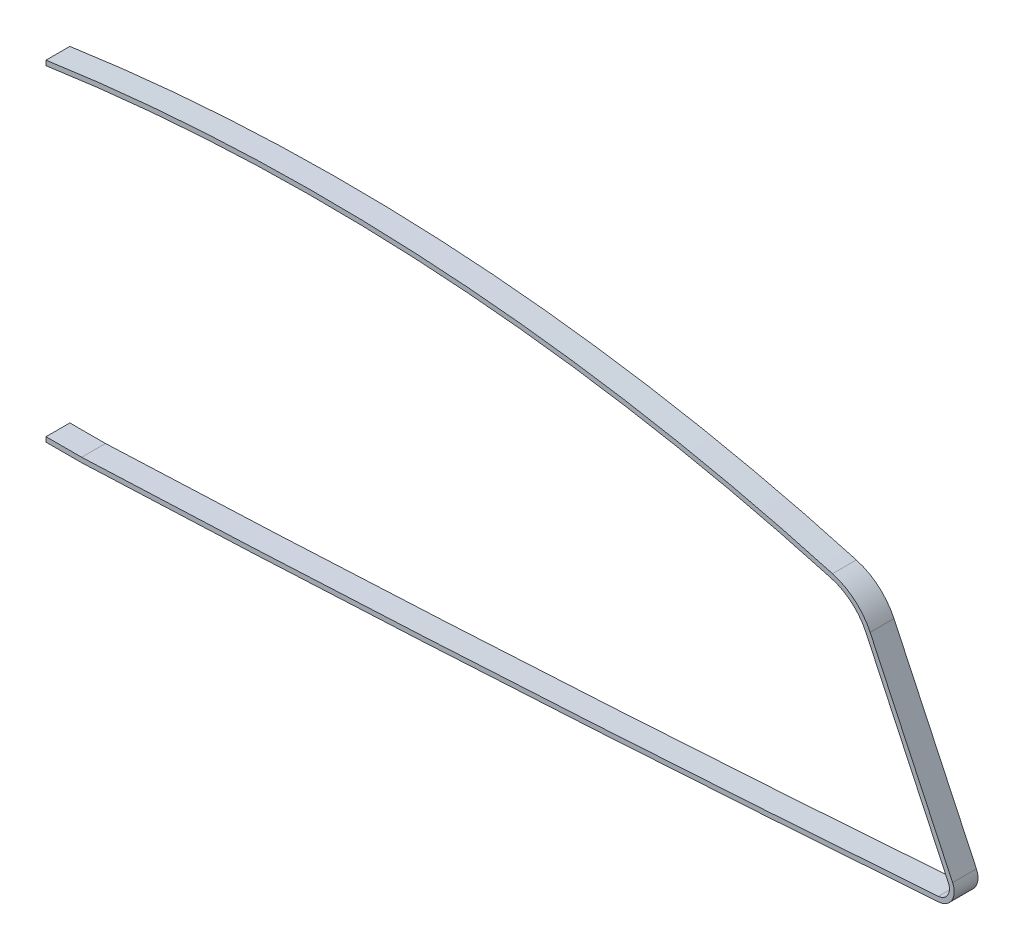
ISO-10303-21;
HEADER;
FILE_DESCRIPTION(('STEP AP214'),'2;1');
FILE_NAME('part.step','',(''),(''),'','','');
FILE_SCHEMA(('AUTOMOTIVE_DESIGN { 1 0 10303 214 1 1 1 1 }'));
ENDSEC;
DATA;
#1=APPLICATION_CONTEXT('core data for automotive mechanical design processes');
#2=APPLICATION_PROTOCOL_DEFINITION('international standard','automotive_design',2000,#1);
#3=PRODUCT_CONTEXT('',#1,'mechanical');
#4=PRODUCT('Part','Part','',(#3));
#5=PRODUCT_RELATED_PRODUCT_CATEGORY('part','',(#4));
#6=PRODUCT_DEFINITION_FORMATION('','',#4);
#7=PRODUCT_DEFINITION_CONTEXT('part definition',#1,'design');
#8=PRODUCT_DEFINITION('design','',#6,#7);
#9=PRODUCT_DEFINITION_SHAPE('','',#8);
#10=(LENGTH_UNIT() NAMED_UNIT(*) SI_UNIT(.MILLI.,.METRE.));
#11=(NAMED_UNIT(*) PLANE_ANGLE_UNIT() SI_UNIT($,.RADIAN.));
#12=(NAMED_UNIT(*) SI_UNIT($,.STERADIAN.) SOLID_ANGLE_UNIT());
#13=UNCERTAINTY_MEASURE_WITH_UNIT(LENGTH_MEASURE(1.E-05),#10,'distance_accuracy_value','');
#14=(GEOMETRIC_REPRESENTATION_CONTEXT(3) GLOBAL_UNCERTAINTY_ASSIGNED_CONTEXT((#13)) GLOBAL_UNIT_ASSIGNED_CONTEXT((#10,
#11,#12)) REPRESENTATION_CONTEXT('',''));
#15=CARTESIAN_POINT('',(0.,0.,0.));
#16=DIRECTION('',(0.,0.,1.));
#17=DIRECTION('',(1.,0.,0.));
#18=AXIS2_PLACEMENT_3D('',#15,#16,#17);
#19=CARTESIAN_POINT('',(-300.,67.7500000000004,6.));
#20=DIRECTION('',(0.,0.,1.));
#21=DIRECTION('',(1.,0.,0.));
#22=AXIS2_PLACEMENT_3D('',#19,#20,#21);
#23=PLANE('',#22);
#24=DIRECTION('',(0.,1.,0.));
#25=VECTOR('',#24,1.);
#26=CARTESIAN_POINT('',(20.,67.7500000000004,6.));
#27=LINE('',#26,#25);
#28=CARTESIAN_POINT('',(20.,-117.000000000003,6.));
#29=VERTEX_POINT('',#28);
#30=CARTESIAN_POINT('',(20.,-115.000000000003,6.));
#31=VERTEX_POINT('',#30);
#32=EDGE_CURVE('E54',#29,#31,#27,.T.);
#33=ORIENTED_EDGE('',*,*,#32,.F.);
#34=DIRECTION('',(1.,0.,0.));
#35=VECTOR('',#34,1.);
#36=CARTESIAN_POINT('',(-293.242078622232,-117.,6.));
#37=LINE('',#36,#35);
#38=CARTESIAN_POINT('',(34.999999999999,-117.000000000003,6.));
#39=VERTEX_POINT('',#38);
#40=EDGE_CURVE('E206',#29,#39,#37,.T.);
#41=ORIENTED_EDGE('',*,*,#40,.T.);
#42=CARTESIAN_POINT('',(-390.042918454936,10661.669527897,6.));
#43=DIRECTION('',(0.,0.,1.));
#44=DIRECTION('',(1.,0.,0.));
#45=AXIS2_PLACEMENT_3D('',#42,#43,#44);
#46=CIRCLE('',#45,10787.046781865);
#47=CARTESIAN_POINT('',(394.557793346134,-96.8052709388142,6.));
#48=VERTEX_POINT('',#47);
#49=EDGE_CURVE('E209',#39,#48,#46,.T.);
#50=ORIENTED_EDGE('',*,*,#49,.T.);
#51=CARTESIAN_POINT('',(394.048645189676,-89.8238120543996,6.));
#52=DIRECTION('',(0.,0.,1.));
#53=DIRECTION('',(1.,0.,0.));
#54=AXIS2_PLACEMENT_3D('',#51,#52,#53);
#55=CIRCLE('',#54,6.99999999999983);
#56=CARTESIAN_POINT('',(400.38450740077,-86.847766012747,6.));
#57=VERTEX_POINT('',#56);
#58=EDGE_CURVE('E213',#48,#57,#55,.T.);
#59=ORIENTED_EDGE('',*,*,#58,.T.);
#60=DIRECTION('',(-0.425149434520998,0.905123173013748,0.));
#61=VECTOR('',#60,1.);
#62=CARTESIAN_POINT('',(400.38450740077,-86.847766012747,6.));
#63=LINE('',#62,#61);
#64=CARTESIAN_POINT('',(365.795573070506,-13.2095497760361,6.));
#65=VERTEX_POINT('',#64);
#66=EDGE_CURVE('E216',#57,#65,#63,.T.);
#67=ORIENTED_EDGE('',*,*,#66,.T.);
#68=CARTESIAN_POINT('',(343.167493745163,-23.8382856390613,6.));
#69=DIRECTION('',(0.,0.,1.));
#70=DIRECTION('',(1.,0.,0.));
#71=AXIS2_PLACEMENT_3D('',#68,#69,#70);
#72=CIRCLE('',#71,24.9999999999999);
#73=CARTESIAN_POINT('',(349.996014283607,0.211065854399894,6.));
#74=VERTEX_POINT('',#73);
#75=EDGE_CURVE('E219',#65,#74,#72,.T.);
#76=ORIENTED_EDGE('',*,*,#75,.T.);
#77=CARTESIAN_POINT('',(134.630812730757,-758.283164695986,6.));
#78=DIRECTION('',(0.,0.,1.));
#79=DIRECTION('',(1.,0.,0.));
#80=AXIS2_PLACEMENT_3D('',#77,#78,#79);
#81=CIRCLE('',#80,788.476802333538);
#82=CARTESIAN_POINT('',(20.,21.8164729086009,6.));
#83=VERTEX_POINT('',#82);
#84=EDGE_CURVE('E150',#74,#83,#81,.T.);
#85=ORIENTED_EDGE('',*,*,#84,.T.);
#86=CARTESIAN_POINT('',(20.,19.7949402404488,6.));
#87=VERTEX_POINT('',#86);
#88=EDGE_CURVE('E138',#87,#83,#27,.T.);
#89=ORIENTED_EDGE('',*,*,#88,.F.);
#90=CARTESIAN_POINT('',(134.630812730757,-758.283164695986,6.));
#91=DIRECTION('',(0.,0.,1.));
#92=DIRECTION('',(1.,0.,0.));
#93=AXIS2_PLACEMENT_3D('',#90,#91,#92);
#94=CIRCLE('',#93,786.476802333538);
#95=CARTESIAN_POINT('',(349.449732640531,-1.71288226507704,6.));
#96=VERTEX_POINT('',#95);
#97=EDGE_CURVE('E148',#96,#87,#94,.T.);
#98=ORIENTED_EDGE('',*,*,#97,.F.);
#99=CARTESIAN_POINT('',(343.167493745163,-23.8382856390613,6.));
#100=DIRECTION('',(0.,0.,1.));
#101=DIRECTION('',(1.,0.,0.));
#102=AXIS2_PLACEMENT_3D('',#99,#100,#101);
#103=CIRCLE('',#102,22.9999999999998);
#104=CARTESIAN_POINT('',(363.985326724479,-14.0598486450781,6.));
#105=VERTEX_POINT('',#104);
#106=EDGE_CURVE('E158',#105,#96,#103,.T.);
#107=ORIENTED_EDGE('',*,*,#106,.F.);
#108=DIRECTION('',(-0.425149434521011,0.905123173013742,0.));
#109=VECTOR('',#108,1.);
#110=CARTESIAN_POINT('',(398.574261054744,-87.6980648817886,6.));
#111=LINE('',#110,#109);
#112=CARTESIAN_POINT('',(398.574261054744,-87.6980648817886,6.));
#113=VERTEX_POINT('',#112);
#114=EDGE_CURVE('E164',#113,#105,#111,.T.);
#115=ORIENTED_EDGE('',*,*,#114,.F.);
#116=CARTESIAN_POINT('',(394.048645189676,-89.8238120543996,6.));
#117=DIRECTION('',(0.,0.,1.));
#118=DIRECTION('',(1.,0.,0.));
#119=AXIS2_PLACEMENT_3D('',#116,#117,#118);
#120=CIRCLE('',#119,5.00000000000083);
#121=CARTESIAN_POINT('',(394.412322444288,-94.810568400411,6.));
#122=VERTEX_POINT('',#121);
#123=EDGE_CURVE('E298',#122,#113,#120,.T.);
#124=ORIENTED_EDGE('',*,*,#123,.F.);
#125=CARTESIAN_POINT('',(-390.042918454936,10661.669527897,6.));
#126=DIRECTION('',(0.,0.,1.));
#127=DIRECTION('',(1.,0.,0.));
#128=AXIS2_PLACEMENT_3D('',#125,#126,#127);
#129=CIRCLE('',#128,10785.046781865);
#130=CARTESIAN_POINT('',(34.9605797810235,-115.000000000002,6.));
#131=VERTEX_POINT('',#130);
#132=EDGE_CURVE('E295',#131,#122,#129,.T.);
#133=ORIENTED_EDGE('',*,*,#132,.F.);
#134=DIRECTION('',(1.,0.,0.));
#135=VECTOR('',#134,1.);
#136=CARTESIAN_POINT('',(-291.219119939477,-115.000000000003,6.));
#137=LINE('',#136,#135);
#138=EDGE_CURVE('E190',#31,#131,#137,.T.);
#139=ORIENTED_EDGE('',*,*,#138,.F.);
#140=EDGE_LOOP('',(#33,#41,#50,#59,#67,#76,#85,#89,#98,#107,#115,#124,#133,#139));
#141=FACE_BOUND('',#140,.T.);
#142=ADVANCED_FACE('F38',(#141),#23,.T.);
#143=CARTESIAN_POINT('',(-300.,67.7500000000004,-4.));
#144=DIRECTION('',(0.,0.,1.));
#145=DIRECTION('',(1.,0.,0.));
#146=AXIS2_PLACEMENT_3D('',#143,#144,#145);
#147=PLANE('',#146);
#148=DIRECTION('',(1.,0.,0.));
#149=VECTOR('',#148,1.);
#150=CARTESIAN_POINT('',(-30.25,-117.,-4.));
#151=LINE('',#150,#149);
#152=CARTESIAN_POINT('',(20.,-117.000000000003,-4.));
#153=VERTEX_POINT('',#152);
#154=CARTESIAN_POINT('',(34.999999999999,-117.000000000003,-4.));
#155=VERTEX_POINT('',#154);
#156=EDGE_CURVE('E205',#153,#155,#151,.T.);
#157=ORIENTED_EDGE('',*,*,#156,.F.);
#158=DIRECTION('',(0.,1.,0.));
#159=VECTOR('',#158,1.);
#160=CARTESIAN_POINT('',(20.,67.7500000000004,-4.));
#161=LINE('',#160,#159);
#162=CARTESIAN_POINT('',(20.,-115.000000000002,-4.));
#163=VERTEX_POINT('',#162);
#164=EDGE_CURVE('E288',#153,#163,#161,.T.);
#165=ORIENTED_EDGE('',*,*,#164,.T.);
#166=DIRECTION('',(1.,0.,0.));
#167=VECTOR('',#166,1.);
#168=CARTESIAN_POINT('',(-30.25,-115.000000000003,-4.));
#169=LINE('',#168,#167);
#170=CARTESIAN_POINT('',(34.9605797810235,-115.000000000002,-4.));
#171=VERTEX_POINT('',#170);
#172=EDGE_CURVE('E168',#163,#171,#169,.T.);
#173=ORIENTED_EDGE('',*,*,#172,.T.);
#174=CARTESIAN_POINT('',(-390.042918454936,10661.669527897,-4.));
#175=DIRECTION('',(0.,0.,1.));
#176=DIRECTION('',(1.,0.,0.));
#177=AXIS2_PLACEMENT_3D('',#174,#175,#176);
#178=CIRCLE('',#177,10785.046781865);
#179=CARTESIAN_POINT('',(394.412322444288,-94.810568400411,-4.));
#180=VERTEX_POINT('',#179);
#181=EDGE_CURVE('E171',#171,#180,#178,.T.);
#182=ORIENTED_EDGE('',*,*,#181,.T.);
#183=CARTESIAN_POINT('',(394.048645189676,-89.8238120543996,-4.));
#184=DIRECTION('',(0.,0.,1.));
#185=DIRECTION('',(1.,0.,0.));
#186=AXIS2_PLACEMENT_3D('',#183,#184,#185);
#187=CIRCLE('',#186,5.00000000000166);
#188=CARTESIAN_POINT('',(398.574261054744,-87.6980648817886,-4.));
#189=VERTEX_POINT('',#188);
#190=EDGE_CURVE('E176',#180,#189,#187,.T.);
#191=ORIENTED_EDGE('',*,*,#190,.T.);
#192=DIRECTION('',(-0.425149434521011,0.905123173013742,0.));
#193=VECTOR('',#192,1.);
#194=CARTESIAN_POINT('',(398.574261054744,-87.6980648817886,-4.));
#195=LINE('',#194,#193);
#196=CARTESIAN_POINT('',(363.985326724479,-14.0598486450781,-4.));
#197=VERTEX_POINT('',#196);
#198=EDGE_CURVE('E180',#189,#197,#195,.T.);
#199=ORIENTED_EDGE('',*,*,#198,.T.);
#200=CARTESIAN_POINT('',(343.167493745163,-23.8382856390613,-4.));
#201=DIRECTION('',(0.,0.,1.));
#202=DIRECTION('',(1.,0.,0.));
#203=AXIS2_PLACEMENT_3D('',#200,#201,#202);
#204=CIRCLE('',#203,22.9999999999998);
#205=CARTESIAN_POINT('',(349.449732640531,-1.71288226507704,-4.));
#206=VERTEX_POINT('',#205);
#207=EDGE_CURVE('E184',#197,#206,#204,.T.);
#208=ORIENTED_EDGE('',*,*,#207,.T.);
#209=CARTESIAN_POINT('',(134.630812730757,-758.283164695986,-4.));
#210=DIRECTION('',(0.,0.,1.));
#211=DIRECTION('',(1.,0.,0.));
#212=AXIS2_PLACEMENT_3D('',#209,#210,#211);
#213=CIRCLE('',#212,786.476802333538);
#214=CARTESIAN_POINT('',(20.,19.7949402404488,-4.));
#215=VERTEX_POINT('',#214);
#216=EDGE_CURVE('E188',#206,#215,#213,.T.);
#217=ORIENTED_EDGE('',*,*,#216,.T.);
#218=CARTESIAN_POINT('',(20.,21.8164729086009,-4.));
#219=VERTEX_POINT('',#218);
#220=EDGE_CURVE('E61',#215,#219,#161,.T.);
#221=ORIENTED_EDGE('',*,*,#220,.T.);
#222=CARTESIAN_POINT('',(134.630812730757,-758.283164695986,-4.));
#223=DIRECTION('',(0.,0.,1.));
#224=DIRECTION('',(1.,0.,0.));
#225=AXIS2_PLACEMENT_3D('',#222,#223,#224);
#226=CIRCLE('',#225,788.476802333538);
#227=CARTESIAN_POINT('',(349.996014283607,0.211065854399894,-4.));
#228=VERTEX_POINT('',#227);
#229=EDGE_CURVE('E210',#228,#219,#226,.T.);
#230=ORIENTED_EDGE('',*,*,#229,.F.);
#231=CARTESIAN_POINT('',(343.167493745163,-23.8382856390613,-4.));
#232=DIRECTION('',(0.,0.,1.));
#233=DIRECTION('',(1.,0.,0.));
#234=AXIS2_PLACEMENT_3D('',#231,#232,#233);
#235=CIRCLE('',#234,24.9999999999999);
#236=CARTESIAN_POINT('',(365.795573070506,-13.2095497760361,-4.));
#237=VERTEX_POINT('',#236);
#238=EDGE_CURVE('E237',#237,#228,#235,.T.);
#239=ORIENTED_EDGE('',*,*,#238,.F.);
#240=DIRECTION('',(-0.425149434520998,0.905123173013748,0.));
#241=VECTOR('',#240,1.);
#242=CARTESIAN_POINT('',(400.38450740077,-86.847766012747,-4.));
#243=LINE('',#242,#241);
#244=CARTESIAN_POINT('',(400.38450740077,-86.847766012747,-4.));
#245=VERTEX_POINT('',#244);
#246=EDGE_CURVE('E234',#245,#237,#243,.T.);
#247=ORIENTED_EDGE('',*,*,#246,.F.);
#248=CARTESIAN_POINT('',(394.048645189676,-89.8238120543996,-4.));
#249=DIRECTION('',(0.,0.,1.));
#250=DIRECTION('',(1.,0.,0.));
#251=AXIS2_PLACEMENT_3D('',#248,#249,#250);
#252=CIRCLE('',#251,7.00000000000029);
#253=CARTESIAN_POINT('',(394.557793346134,-96.8052709388142,-4.));
#254=VERTEX_POINT('',#253);
#255=EDGE_CURVE('E231',#254,#245,#252,.T.);
#256=ORIENTED_EDGE('',*,*,#255,.F.);
#257=CARTESIAN_POINT('',(-390.042918454936,10661.669527897,-4.));
#258=DIRECTION('',(0.,0.,1.));
#259=DIRECTION('',(1.,0.,0.));
#260=AXIS2_PLACEMENT_3D('',#257,#258,#259);
#261=CIRCLE('',#260,10787.046781865);
#262=EDGE_CURVE('E227',#155,#254,#261,.T.);
#263=ORIENTED_EDGE('',*,*,#262,.F.);
#264=EDGE_LOOP('',(#157,#165,#173,#182,#191,#199,#208,#217,#221,#230,#239,#247,#256,#263));
#265=FACE_BOUND('',#264,.T.);
#266=ADVANCED_FACE('F269',(#265),#147,.F.);
#267=CARTESIAN_POINT('',(-30.25,-117.,6.));
#268=DIRECTION('',(0.,1.,0.));
#269=DIRECTION('',(-1.,0.,0.));
#270=AXIS2_PLACEMENT_3D('',#267,#268,#269);
#271=PLANE('',#270);
#272=ORIENTED_EDGE('',*,*,#40,.F.);
#273=DIRECTION('',(0.,0.,-1.));
#274=VECTOR('',#273,1.);
#275=CARTESIAN_POINT('',(20.,-117.000000000002,6.));
#276=LINE('',#275,#274);
#277=EDGE_CURVE('E172',#29,#153,#276,.T.);
#278=ORIENTED_EDGE('',*,*,#277,.T.);
#279=ORIENTED_EDGE('',*,*,#156,.T.);
#280=DIRECTION('',(0.,0.,-1.));
#281=VECTOR('',#280,1.);
#282=CARTESIAN_POINT('',(34.999999999999,-117.000000000003,6.));
#283=LINE('',#282,#281);
#284=EDGE_CURVE('E47',#39,#155,#283,.T.);
#285=ORIENTED_EDGE('',*,*,#284,.F.);
#286=EDGE_LOOP('',(#272,#278,#279,#285));
#287=FACE_BOUND('',#286,.T.);
#288=ADVANCED_FACE('F40',(#287),#271,.F.);
#289=CARTESIAN_POINT('',(-390.042918454936,10661.669527897,6.));
#290=DIRECTION('',(0.,0.,-1.));
#291=DIRECTION('',(-1.,0.,0.));
#292=AXIS2_PLACEMENT_3D('',#289,#290,#291);
#293=CYLINDRICAL_SURFACE('',#292,10787.046781865);
#294=ORIENTED_EDGE('',*,*,#262,.T.);
#295=DIRECTION('',(0.,0.,-1.));
#296=VECTOR('',#295,1.);
#297=CARTESIAN_POINT('',(394.557793346134,-96.8052709388142,6.));
#298=LINE('',#297,#296);
#299=EDGE_CURVE('E254',#48,#254,#298,.T.);
#300=ORIENTED_EDGE('',*,*,#299,.F.);
#301=ORIENTED_EDGE('',*,*,#49,.F.);
#302=ORIENTED_EDGE('',*,*,#284,.T.);
#303=EDGE_LOOP('',(#294,#300,#301,#302));
#304=FACE_BOUND('',#303,.T.);
#305=ADVANCED_FACE('F263',(#304),#293,.T.);
#306=CARTESIAN_POINT('',(394.048645189676,-89.8238120543996,6.));
#307=DIRECTION('',(0.,0.,-1.));
#308=DIRECTION('',(-1.,0.,0.));
#309=AXIS2_PLACEMENT_3D('',#306,#307,#308);
#310=CYLINDRICAL_SURFACE('',#309,7.00000000000029);
#311=ORIENTED_EDGE('',*,*,#255,.T.);
#312=DIRECTION('',(0.,0.,-1.));
#313=VECTOR('',#312,1.);
#314=CARTESIAN_POINT('',(400.38450740077,-86.847766012747,6.));
#315=LINE('',#314,#313);
#316=EDGE_CURVE('E250',#57,#245,#315,.T.);
#317=ORIENTED_EDGE('',*,*,#316,.F.);
#318=ORIENTED_EDGE('',*,*,#58,.F.);
#319=ORIENTED_EDGE('',*,*,#299,.T.);
#320=EDGE_LOOP('',(#311,#317,#318,#319));
#321=FACE_BOUND('',#320,.T.);
#322=ADVANCED_FACE('F275',(#321),#310,.T.);
#323=CARTESIAN_POINT('',(400.38450740077,-86.847766012747,6.));
#324=DIRECTION('',(-0.905123173013748,-0.425149434520998,0.));
#325=DIRECTION('',(0.425149434520998,-0.905123173013748,0.));
#326=AXIS2_PLACEMENT_3D('',#323,#324,#325);
#327=PLANE('',#326);
#328=ORIENTED_EDGE('',*,*,#246,.T.);
#329=DIRECTION('',(0.,0.,-1.));
#330=VECTOR('',#329,1.);
#331=CARTESIAN_POINT('',(365.795573070506,-13.2095497760361,6.));
#332=LINE('',#331,#330);
#333=EDGE_CURVE('E246',#65,#237,#332,.T.);
#334=ORIENTED_EDGE('',*,*,#333,.F.);
#335=ORIENTED_EDGE('',*,*,#66,.F.);
#336=ORIENTED_EDGE('',*,*,#316,.T.);
#337=EDGE_LOOP('',(#328,#334,#335,#336));
#338=FACE_BOUND('',#337,.T.);
#339=ADVANCED_FACE('F279',(#338),#327,.F.);
#340=CARTESIAN_POINT('',(343.167493745163,-23.8382856390613,6.));
#341=DIRECTION('',(0.,0.,-1.));
#342=DIRECTION('',(-1.,0.,0.));
#343=AXIS2_PLACEMENT_3D('',#340,#341,#342);
#344=CYLINDRICAL_SURFACE('',#343,24.9999999999999);
#345=ORIENTED_EDGE('',*,*,#238,.T.);
#346=DIRECTION('',(0.,0.,-1.));
#347=VECTOR('',#346,1.);
#348=CARTESIAN_POINT('',(349.996014283607,0.211065854399894,6.));
#349=LINE('',#348,#347);
#350=EDGE_CURVE('E224',#74,#228,#349,.T.);
#351=ORIENTED_EDGE('',*,*,#350,.F.);
#352=ORIENTED_EDGE('',*,*,#75,.F.);
#353=ORIENTED_EDGE('',*,*,#333,.T.);
#354=EDGE_LOOP('',(#345,#351,#352,#353));
#355=FACE_BOUND('',#354,.T.);
#356=ADVANCED_FACE('F331',(#355),#344,.T.);
#357=CARTESIAN_POINT('',(134.630812730757,-758.283164695986,6.));
#358=DIRECTION('',(0.,0.,-1.));
#359=DIRECTION('',(-1.,0.,0.));
#360=AXIS2_PLACEMENT_3D('',#357,#358,#359);
#361=CYLINDRICAL_SURFACE('',#360,788.476802333538);
#362=ORIENTED_EDGE('',*,*,#229,.T.);
#363=DIRECTION('',(0.,0.,-1.));
#364=VECTOR('',#363,1.);
#365=CARTESIAN_POINT('',(20.,21.8164729086009,6.));
#366=LINE('',#365,#364);
#367=EDGE_CURVE('E152',#219,#83,#366,.F.);
#368=ORIENTED_EDGE('',*,*,#367,.T.);
#369=ORIENTED_EDGE('',*,*,#84,.F.);
#370=ORIENTED_EDGE('',*,*,#350,.T.);
#371=EDGE_LOOP('',(#362,#368,#369,#370));
#372=FACE_BOUND('',#371,.T.);
#373=ADVANCED_FACE('F329',(#372),#361,.T.);
#374=CARTESIAN_POINT('',(-30.25,-115.000000000003,6.));
#375=DIRECTION('',(0.,1.,0.));
#376=DIRECTION('',(-1.,0.,0.));
#377=AXIS2_PLACEMENT_3D('',#374,#375,#376);
#378=PLANE('',#377);
#379=DIRECTION('',(0.,0.,-1.));
#380=VECTOR('',#379,1.);
#381=CARTESIAN_POINT('',(20.,-115.000000000002,6.));
#382=LINE('',#381,#380);
#383=EDGE_CURVE('E291',#31,#163,#382,.T.);
#384=ORIENTED_EDGE('',*,*,#383,.F.);
#385=ORIENTED_EDGE('',*,*,#138,.T.);
#386=DIRECTION('',(0.,0.,-1.));
#387=VECTOR('',#386,1.);
#388=CARTESIAN_POINT('',(34.9605797810235,-115.000000000002,6.));
#389=LINE('',#388,#387);
#390=EDGE_CURVE('E201',#131,#171,#389,.T.);
#391=ORIENTED_EDGE('',*,*,#390,.T.);
#392=ORIENTED_EDGE('',*,*,#172,.F.);
#393=EDGE_LOOP('',(#384,#385,#391,#392));
#394=FACE_BOUND('',#393,.T.);
#395=ADVANCED_FACE('F320',(#394),#378,.T.);
#396=CARTESIAN_POINT('',(-390.042918454936,10661.669527897,6.));
#397=DIRECTION('',(0.,0.,-1.));
#398=DIRECTION('',(-1.,0.,0.));
#399=AXIS2_PLACEMENT_3D('',#396,#397,#398);
#400=CYLINDRICAL_SURFACE('',#399,10785.046781865);
#401=ORIENTED_EDGE('',*,*,#181,.F.);
#402=ORIENTED_EDGE('',*,*,#390,.F.);
#403=ORIENTED_EDGE('',*,*,#132,.T.);
#404=DIRECTION('',(0.,0.,-1.));
#405=VECTOR('',#404,1.);
#406=CARTESIAN_POINT('',(394.412322444288,-94.810568400411,6.));
#407=LINE('',#406,#405);
#408=EDGE_CURVE('E197',#122,#180,#407,.T.);
#409=ORIENTED_EDGE('',*,*,#408,.T.);
#410=EDGE_LOOP('',(#401,#402,#403,#409));
#411=FACE_BOUND('',#410,.T.);
#412=ADVANCED_FACE('F316',(#411),#400,.F.);
#413=CARTESIAN_POINT('',(394.048645189676,-89.8238120543996,6.));
#414=DIRECTION('',(0.,0.,-1.));
#415=DIRECTION('',(-1.,0.,0.));
#416=AXIS2_PLACEMENT_3D('',#413,#414,#415);
#417=CYLINDRICAL_SURFACE('',#416,5.00000000000166);
#418=ORIENTED_EDGE('',*,*,#190,.F.);
#419=ORIENTED_EDGE('',*,*,#408,.F.);
#420=ORIENTED_EDGE('',*,*,#123,.T.);
#421=DIRECTION('',(0.,0.,-1.));
#422=VECTOR('',#421,1.);
#423=CARTESIAN_POINT('',(398.574261054744,-87.6980648817886,6.));
#424=LINE('',#423,#422);
#425=EDGE_CURVE('E194',#113,#189,#424,.T.);
#426=ORIENTED_EDGE('',*,*,#425,.T.);
#427=EDGE_LOOP('',(#418,#419,#420,#426));
#428=FACE_BOUND('',#427,.T.);
#429=ADVANCED_FACE('F314',(#428),#417,.F.);
#430=CARTESIAN_POINT('',(398.574261054744,-87.6980648817886,6.));
#431=DIRECTION('',(-0.905123173013742,-0.425149434521011,0.));
#432=DIRECTION('',(0.425149434521011,-0.905123173013742,0.));
#433=AXIS2_PLACEMENT_3D('',#430,#431,#432);
#434=PLANE('',#433);
#435=ORIENTED_EDGE('',*,*,#198,.F.);
#436=ORIENTED_EDGE('',*,*,#425,.F.);
#437=ORIENTED_EDGE('',*,*,#114,.T.);
#438=DIRECTION('',(0.,0.,-1.));
#439=VECTOR('',#438,1.);
#440=CARTESIAN_POINT('',(363.985326724479,-14.0598486450781,6.));
#441=LINE('',#440,#439);
#442=EDGE_CURVE('E162',#105,#197,#441,.T.);
#443=ORIENTED_EDGE('',*,*,#442,.T.);
#444=EDGE_LOOP('',(#435,#436,#437,#443));
#445=FACE_BOUND('',#444,.T.);
#446=ADVANCED_FACE('F306',(#445),#434,.T.);
#447=CARTESIAN_POINT('',(343.167493745163,-23.8382856390613,6.));
#448=DIRECTION('',(0.,0.,-1.));
#449=DIRECTION('',(-1.,0.,0.));
#450=AXIS2_PLACEMENT_3D('',#447,#448,#449);
#451=CYLINDRICAL_SURFACE('',#450,22.9999999999998);
#452=ORIENTED_EDGE('',*,*,#207,.F.);
#453=ORIENTED_EDGE('',*,*,#442,.F.);
#454=ORIENTED_EDGE('',*,*,#106,.T.);
#455=DIRECTION('',(0.,0.,-1.));
#456=VECTOR('',#455,1.);
#457=CARTESIAN_POINT('',(349.449732640531,-1.71288226507704,6.));
#458=LINE('',#457,#456);
#459=EDGE_CURVE('E156',#96,#206,#458,.T.);
#460=ORIENTED_EDGE('',*,*,#459,.T.);
#461=EDGE_LOOP('',(#452,#453,#454,#460));
#462=FACE_BOUND('',#461,.T.);
#463=ADVANCED_FACE('F310',(#462),#451,.F.);
#464=CARTESIAN_POINT('',(134.630812730757,-758.283164695986,6.));
#465=DIRECTION('',(0.,0.,-1.));
#466=DIRECTION('',(-1.,0.,0.));
#467=AXIS2_PLACEMENT_3D('',#464,#465,#466);
#468=CYLINDRICAL_SURFACE('',#467,786.476802333538);
#469=DIRECTION('',(0.,0.,-1.));
#470=VECTOR('',#469,1.);
#471=CARTESIAN_POINT('',(20.,19.7949402404488,6.));
#472=LINE('',#471,#470);
#473=EDGE_CURVE('E11',#215,#87,#472,.F.);
#474=ORIENTED_EDGE('',*,*,#473,.F.);
#475=ORIENTED_EDGE('',*,*,#216,.F.);
#476=ORIENTED_EDGE('',*,*,#459,.F.);
#477=ORIENTED_EDGE('',*,*,#97,.T.);
#478=EDGE_LOOP('',(#474,#475,#476,#477));
#479=FACE_BOUND('',#478,.T.);
#480=ADVANCED_FACE('F155',(#479),#468,.F.);
#481=CARTESIAN_POINT('',(20.,0.,0.));
#482=DIRECTION('',(1.,0.,0.));
#483=DIRECTION('',(0.,0.,-1.));
#484=AXIS2_PLACEMENT_3D('',#481,#482,#483);
#485=PLANE('',#484);
#486=ORIENTED_EDGE('',*,*,#220,.F.);
#487=ORIENTED_EDGE('',*,*,#473,.T.);
#488=ORIENTED_EDGE('',*,*,#88,.T.);
#489=ORIENTED_EDGE('',*,*,#367,.F.);
#490=EDGE_LOOP('',(#486,#487,#488,#489));
#491=FACE_BOUND('',#490,.T.);
#492=ADVANCED_FACE('F137',(#491),#485,.F.);
#493=ORIENTED_EDGE('',*,*,#32,.T.);
#494=ORIENTED_EDGE('',*,*,#383,.T.);
#495=ORIENTED_EDGE('',*,*,#164,.F.);
#496=ORIENTED_EDGE('',*,*,#277,.F.);
#497=EDGE_LOOP('',(#493,#494,#495,#496));
#498=FACE_BOUND('',#497,.T.);
#499=ADVANCED_FACE('F359',(#498),#485,.F.);
#500=CLOSED_SHELL('',(#142,#266,#288,#305,#322,#339,#356,#373,#395,#412,#429,#446,#463,#480,
#492,#499));
#501=MANIFOLD_SOLID_BREP('B2',#500);
#502=ADVANCED_BREP_SHAPE_REPRESENTATION('',(#18,#501),#14);
#503=SHAPE_DEFINITION_REPRESENTATION(#9,#502);
ENDSEC;
END-ISO-10303-21;
